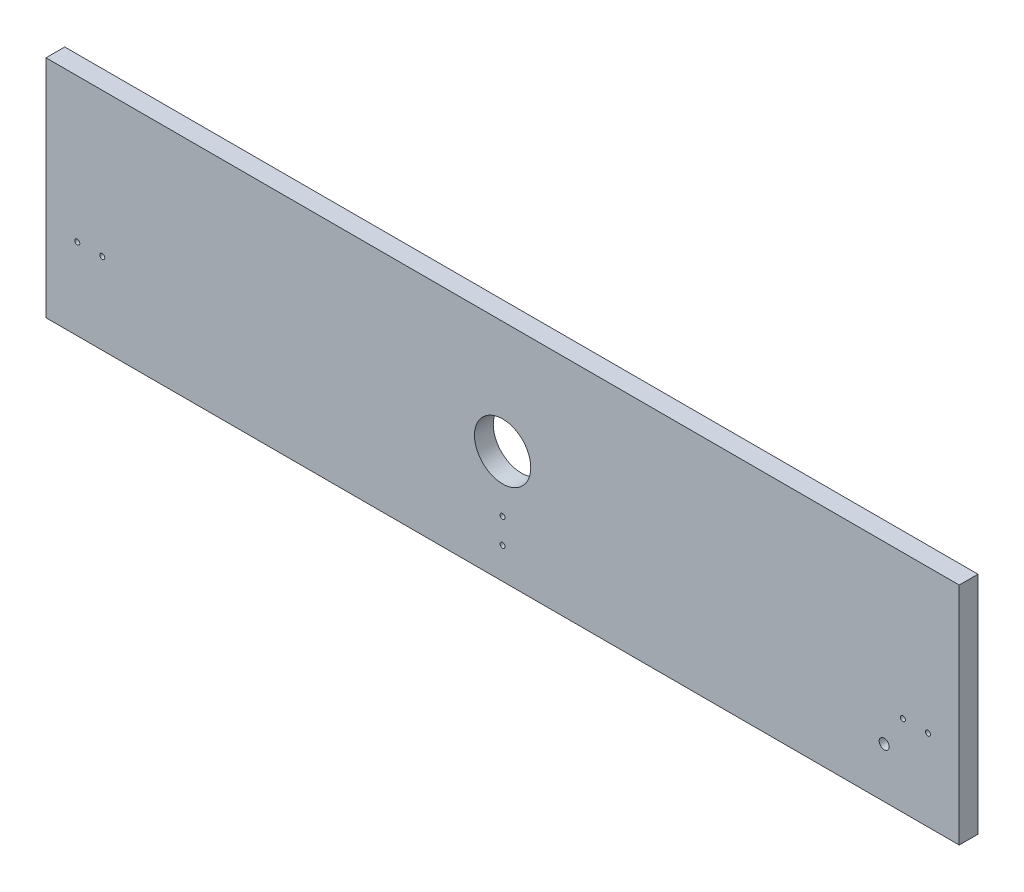
ISO-10303-21;
HEADER;
FILE_DESCRIPTION(('STEP AP214'),'2;1');
FILE_NAME('part.step','',(''),(''),'','','');
FILE_SCHEMA(('AUTOMOTIVE_DESIGN { 1 0 10303 214 1 1 1 1 }'));
ENDSEC;
DATA;
#1=APPLICATION_CONTEXT('core data for automotive mechanical design processes');
#2=APPLICATION_PROTOCOL_DEFINITION('international standard','automotive_design',2000,#1);
#3=PRODUCT_CONTEXT('',#1,'mechanical');
#4=PRODUCT('Part','Part','',(#3));
#5=PRODUCT_RELATED_PRODUCT_CATEGORY('part','',(#4));
#6=PRODUCT_DEFINITION_FORMATION('','',#4);
#7=PRODUCT_DEFINITION_CONTEXT('part definition',#1,'design');
#8=PRODUCT_DEFINITION('design','',#6,#7);
#9=PRODUCT_DEFINITION_SHAPE('','',#8);
#10=(LENGTH_UNIT() NAMED_UNIT(*) SI_UNIT(.MILLI.,.METRE.));
#11=(NAMED_UNIT(*) PLANE_ANGLE_UNIT() SI_UNIT($,.RADIAN.));
#12=(NAMED_UNIT(*) SI_UNIT($,.STERADIAN.) SOLID_ANGLE_UNIT());
#13=UNCERTAINTY_MEASURE_WITH_UNIT(LENGTH_MEASURE(1.E-05),#10,'distance_accuracy_value','');
#14=(GEOMETRIC_REPRESENTATION_CONTEXT(3) GLOBAL_UNCERTAINTY_ASSIGNED_CONTEXT((#13)) GLOBAL_UNIT_ASSIGNED_CONTEXT((#10,
#11,#12)) REPRESENTATION_CONTEXT('',''));
#15=CARTESIAN_POINT('',(0.,0.,0.));
#16=DIRECTION('',(0.,0.,1.));
#17=DIRECTION('',(1.,0.,0.));
#18=AXIS2_PLACEMENT_3D('',#15,#16,#17);
#19=CARTESIAN_POINT('',(365.,-90.,15.));
#20=DIRECTION('',(-1.,0.,0.));
#21=DIRECTION('',(0.,-1.,0.));
#22=AXIS2_PLACEMENT_3D('',#19,#20,#21);
#23=PLANE('',#22);
#24=DIRECTION('',(0.,1.,0.));
#25=VECTOR('',#24,1.);
#26=CARTESIAN_POINT('',(365.,-90.,0.));
#27=LINE('',#26,#25);
#28=CARTESIAN_POINT('',(365.,-90.,0.));
#29=VERTEX_POINT('',#28);
#30=CARTESIAN_POINT('',(365.,90.,0.));
#31=VERTEX_POINT('',#30);
#32=EDGE_CURVE('E96',#29,#31,#27,.T.);
#33=ORIENTED_EDGE('',*,*,#32,.T.);
#34=DIRECTION('',(0.,0.,-1.));
#35=VECTOR('',#34,1.);
#36=CARTESIAN_POINT('',(365.,90.,15.));
#37=LINE('',#36,#35);
#38=CARTESIAN_POINT('',(365.,90.,15.));
#39=VERTEX_POINT('',#38);
#40=EDGE_CURVE('E11',#39,#31,#37,.T.);
#41=ORIENTED_EDGE('',*,*,#40,.F.);
#42=DIRECTION('',(0.,1.,0.));
#43=VECTOR('',#42,1.);
#44=CARTESIAN_POINT('',(365.,-90.,15.));
#45=LINE('',#44,#43);
#46=CARTESIAN_POINT('',(365.,-90.,15.));
#47=VERTEX_POINT('',#46);
#48=EDGE_CURVE('E84',#47,#39,#45,.T.);
#49=ORIENTED_EDGE('',*,*,#48,.F.);
#50=DIRECTION('',(0.,0.,-1.));
#51=VECTOR('',#50,1.);
#52=CARTESIAN_POINT('',(365.,-90.,15.));
#53=LINE('',#52,#51);
#54=EDGE_CURVE('E92',#47,#29,#53,.T.);
#55=ORIENTED_EDGE('',*,*,#54,.T.);
#56=EDGE_LOOP('',(#33,#41,#49,#55));
#57=FACE_BOUND('',#56,.T.);
#58=ADVANCED_FACE('F33',(#57),#23,.F.);
#59=CARTESIAN_POINT('',(-365.,90.,15.));
#60=DIRECTION('',(0.,-1.,0.));
#61=DIRECTION('',(0.,0.,-1.));
#62=AXIS2_PLACEMENT_3D('',#59,#60,#61);
#63=PLANE('',#62);
#64=DIRECTION('',(-1.,0.,0.));
#65=VECTOR('',#64,1.);
#66=CARTESIAN_POINT('',(-365.,90.,0.));
#67=LINE('',#66,#65);
#68=CARTESIAN_POINT('',(-365.,90.,0.));
#69=VERTEX_POINT('',#68);
#70=EDGE_CURVE('E88',#31,#69,#67,.T.);
#71=ORIENTED_EDGE('',*,*,#70,.T.);
#72=DIRECTION('',(0.,0.,-1.));
#73=VECTOR('',#72,1.);
#74=CARTESIAN_POINT('',(-365.,90.,15.));
#75=LINE('',#74,#73);
#76=CARTESIAN_POINT('',(-365.,90.,15.));
#77=VERTEX_POINT('',#76);
#78=EDGE_CURVE('E41',#77,#69,#75,.T.);
#79=ORIENTED_EDGE('',*,*,#78,.F.);
#80=DIRECTION('',(-1.,0.,0.));
#81=VECTOR('',#80,1.);
#82=CARTESIAN_POINT('',(-365.,90.,15.));
#83=LINE('',#82,#81);
#84=EDGE_CURVE('E79',#39,#77,#83,.T.);
#85=ORIENTED_EDGE('',*,*,#84,.F.);
#86=ORIENTED_EDGE('',*,*,#40,.T.);
#87=EDGE_LOOP('',(#71,#79,#85,#86));
#88=FACE_BOUND('',#87,.T.);
#89=ADVANCED_FACE('F87',(#88),#63,.F.);
#90=CARTESIAN_POINT('',(-365.,-90.,15.));
#91=DIRECTION('',(1.,0.,0.));
#92=DIRECTION('',(0.,1.,0.));
#93=AXIS2_PLACEMENT_3D('',#90,#91,#92);
#94=PLANE('',#93);
#95=DIRECTION('',(0.,-1.,0.));
#96=VECTOR('',#95,1.);
#97=CARTESIAN_POINT('',(-365.,-90.,0.));
#98=LINE('',#97,#96);
#99=CARTESIAN_POINT('',(-365.,-90.,0.));
#100=VERTEX_POINT('',#99);
#101=EDGE_CURVE('E66',#69,#100,#98,.T.);
#102=ORIENTED_EDGE('',*,*,#101,.T.);
#103=DIRECTION('',(0.,0.,-1.));
#104=VECTOR('',#103,1.);
#105=CARTESIAN_POINT('',(-365.,-90.,15.));
#106=LINE('',#105,#104);
#107=CARTESIAN_POINT('',(-365.,-90.,15.));
#108=VERTEX_POINT('',#107);
#109=EDGE_CURVE('E89',#108,#100,#106,.T.);
#110=ORIENTED_EDGE('',*,*,#109,.F.);
#111=DIRECTION('',(0.,-1.,0.));
#112=VECTOR('',#111,1.);
#113=CARTESIAN_POINT('',(-365.,-90.,15.));
#114=LINE('',#113,#112);
#115=EDGE_CURVE('E82',#77,#108,#114,.T.);
#116=ORIENTED_EDGE('',*,*,#115,.F.);
#117=ORIENTED_EDGE('',*,*,#78,.T.);
#118=EDGE_LOOP('',(#102,#110,#116,#117));
#119=FACE_BOUND('',#118,.T.);
#120=ADVANCED_FACE('F90',(#119),#94,.F.);
#121=CARTESIAN_POINT('',(-365.,-90.,15.));
#122=DIRECTION('',(0.,1.,0.));
#123=DIRECTION('',(0.,0.,1.));
#124=AXIS2_PLACEMENT_3D('',#121,#122,#123);
#125=PLANE('',#124);
#126=DIRECTION('',(1.,0.,0.));
#127=VECTOR('',#126,1.);
#128=CARTESIAN_POINT('',(-365.,-90.,0.));
#129=LINE('',#128,#127);
#130=EDGE_CURVE('E72',#100,#29,#129,.T.);
#131=ORIENTED_EDGE('',*,*,#130,.T.);
#132=ORIENTED_EDGE('',*,*,#54,.F.);
#133=DIRECTION('',(1.,0.,0.));
#134=VECTOR('',#133,1.);
#135=CARTESIAN_POINT('',(-365.,-90.,15.));
#136=LINE('',#135,#134);
#137=EDGE_CURVE('E49',#108,#47,#136,.T.);
#138=ORIENTED_EDGE('',*,*,#137,.F.);
#139=ORIENTED_EDGE('',*,*,#109,.T.);
#140=EDGE_LOOP('',(#131,#132,#138,#139));
#141=FACE_BOUND('',#140,.T.);
#142=ADVANCED_FACE('F104',(#141),#125,.F.);
#143=CARTESIAN_POINT('',(0.,0.,15.));
#144=DIRECTION('',(0.,0.,-1.));
#145=DIRECTION('',(-1.,0.,0.));
#146=AXIS2_PLACEMENT_3D('',#143,#144,#145);
#147=PLANE('',#146);
#148=CARTESIAN_POINT('',(305.,-50.,15.));
#149=DIRECTION('',(0.,0.,-1.));
#150=DIRECTION('',(-1.,0.,0.));
#151=AXIS2_PLACEMENT_3D('',#148,#149,#150);
#152=CIRCLE('',#151,3.99999999999999);
#153=CARTESIAN_POINT('',(301.,-50.,15.));
#154=VERTEX_POINT('',#153);
#155=EDGE_CURVE('E151',#154,#154,#152,.F.);
#156=ORIENTED_EDGE('',*,*,#155,.F.);
#157=EDGE_LOOP('',(#156));
#158=FACE_BOUND('',#157,.T.);
#159=CARTESIAN_POINT('',(0.,0.,15.));
#160=DIRECTION('',(0.,0.,1.));
#161=DIRECTION('',(1.,0.,0.));
#162=AXIS2_PLACEMENT_3D('',#159,#160,#161);
#163=CIRCLE('',#162,22.5);
#164=CARTESIAN_POINT('',(22.5,0.,15.));
#165=VERTEX_POINT('',#164);
#166=EDGE_CURVE('E148',#165,#165,#163,.T.);
#167=ORIENTED_EDGE('',*,*,#166,.F.);
#168=EDGE_LOOP('',(#167));
#169=FACE_BOUND('',#168,.T.);
#170=CARTESIAN_POINT('',(320.,-24.9999999999999,15.));
#171=DIRECTION('',(0.,0.,1.));
#172=DIRECTION('',(1.,0.,0.));
#173=AXIS2_PLACEMENT_3D('',#170,#171,#172);
#174=CIRCLE('',#173,2.);
#175=CARTESIAN_POINT('',(322.,-24.9999999999999,15.));
#176=VERTEX_POINT('',#175);
#177=EDGE_CURVE('E140',#176,#176,#174,.T.);
#178=ORIENTED_EDGE('',*,*,#177,.F.);
#179=EDGE_LOOP('',(#178));
#180=FACE_BOUND('',#179,.T.);
#181=CARTESIAN_POINT('',(340.,-25.,15.));
#182=DIRECTION('',(0.,0.,1.));
#183=DIRECTION('',(1.,0.,0.));
#184=AXIS2_PLACEMENT_3D('',#181,#182,#183);
#185=CIRCLE('',#184,2.);
#186=CARTESIAN_POINT('',(342.,-25.,15.));
#187=VERTEX_POINT('',#186);
#188=EDGE_CURVE('E134',#187,#187,#185,.T.);
#189=ORIENTED_EDGE('',*,*,#188,.F.);
#190=EDGE_LOOP('',(#189));
#191=FACE_BOUND('',#190,.T.);
#192=CARTESIAN_POINT('',(-320.,-25.,15.));
#193=DIRECTION('',(0.,0.,1.));
#194=DIRECTION('',(1.,0.,0.));
#195=AXIS2_PLACEMENT_3D('',#192,#193,#194);
#196=CIRCLE('',#195,2.);
#197=CARTESIAN_POINT('',(-318.,-25.,15.));
#198=VERTEX_POINT('',#197);
#199=EDGE_CURVE('E128',#198,#198,#196,.T.);
#200=ORIENTED_EDGE('',*,*,#199,.F.);
#201=EDGE_LOOP('',(#200));
#202=FACE_BOUND('',#201,.T.);
#203=CARTESIAN_POINT('',(0.,-45.,15.));
#204=DIRECTION('',(0.,0.,1.));
#205=DIRECTION('',(1.,0.,0.));
#206=AXIS2_PLACEMENT_3D('',#203,#204,#205);
#207=CIRCLE('',#206,2.);
#208=CARTESIAN_POINT('',(2.,-45.,15.));
#209=VERTEX_POINT('',#208);
#210=EDGE_CURVE('E122',#209,#209,#207,.T.);
#211=ORIENTED_EDGE('',*,*,#210,.F.);
#212=EDGE_LOOP('',(#211));
#213=FACE_BOUND('',#212,.T.);
#214=CARTESIAN_POINT('',(0.,-65.,15.));
#215=DIRECTION('',(0.,0.,1.));
#216=DIRECTION('',(1.,0.,0.));
#217=AXIS2_PLACEMENT_3D('',#214,#215,#216);
#218=CIRCLE('',#217,2.);
#219=CARTESIAN_POINT('',(2.,-65.,15.));
#220=VERTEX_POINT('',#219);
#221=EDGE_CURVE('E116',#220,#220,#218,.T.);
#222=ORIENTED_EDGE('',*,*,#221,.F.);
#223=EDGE_LOOP('',(#222));
#224=FACE_BOUND('',#223,.T.);
#225=CARTESIAN_POINT('',(-340.,-25.,15.));
#226=DIRECTION('',(0.,0.,1.));
#227=DIRECTION('',(1.,0.,0.));
#228=AXIS2_PLACEMENT_3D('',#225,#226,#227);
#229=CIRCLE('',#228,2.);
#230=CARTESIAN_POINT('',(-338.,-25.,15.));
#231=VERTEX_POINT('',#230);
#232=EDGE_CURVE('E110',#231,#231,#229,.T.);
#233=ORIENTED_EDGE('',*,*,#232,.F.);
#234=EDGE_LOOP('',(#233));
#235=FACE_BOUND('',#234,.T.);
#236=ORIENTED_EDGE('',*,*,#48,.T.);
#237=ORIENTED_EDGE('',*,*,#84,.T.);
#238=ORIENTED_EDGE('',*,*,#115,.T.);
#239=ORIENTED_EDGE('',*,*,#137,.T.);
#240=EDGE_LOOP('',(#236,#237,#238,#239));
#241=FACE_BOUND('',#240,.T.);
#242=ADVANCED_FACE('F80',(#158,#169,#180,#191,#202,#213,#224,#235,#241),#147,.F.);
#243=CARTESIAN_POINT('',(0.,0.,0.));
#244=DIRECTION('',(0.,0.,-1.));
#245=DIRECTION('',(-1.,0.,0.));
#246=AXIS2_PLACEMENT_3D('',#243,#244,#245);
#247=PLANE('',#246);
#248=CARTESIAN_POINT('',(305.,-50.,0.));
#249=DIRECTION('',(0.,0.,-1.));
#250=DIRECTION('',(-1.,0.,0.));
#251=AXIS2_PLACEMENT_3D('',#248,#249,#250);
#252=CIRCLE('',#251,3.99999999999999);
#253=CARTESIAN_POINT('',(301.,-50.,0.));
#254=VERTEX_POINT('',#253);
#255=EDGE_CURVE('E154',#254,#254,#252,.T.);
#256=ORIENTED_EDGE('',*,*,#255,.F.);
#257=EDGE_LOOP('',(#256));
#258=FACE_BOUND('',#257,.T.);
#259=CARTESIAN_POINT('',(0.,0.,0.));
#260=DIRECTION('',(0.,0.,-1.));
#261=DIRECTION('',(-1.,0.,0.));
#262=AXIS2_PLACEMENT_3D('',#259,#260,#261);
#263=CIRCLE('',#262,22.5);
#264=CARTESIAN_POINT('',(-22.5,0.,0.));
#265=VERTEX_POINT('',#264);
#266=EDGE_CURVE('E143',#265,#265,#263,.F.);
#267=ORIENTED_EDGE('',*,*,#266,.T.);
#268=EDGE_LOOP('',(#267));
#269=FACE_BOUND('',#268,.T.);
#270=ORIENTED_EDGE('',*,*,#32,.F.);
#271=ORIENTED_EDGE('',*,*,#130,.F.);
#272=ORIENTED_EDGE('',*,*,#101,.F.);
#273=ORIENTED_EDGE('',*,*,#70,.F.);
#274=EDGE_LOOP('',(#270,#271,#272,#273));
#275=FACE_BOUND('',#274,.T.);
#276=ADVANCED_FACE('F107',(#258,#269,#275),#247,.T.);
#277=CARTESIAN_POINT('',(-340.,-25.,5.));
#278=DIRECTION('',(0.,0.,1.));
#279=DIRECTION('',(1.,0.,0.));
#280=AXIS2_PLACEMENT_3D('',#277,#278,#279);
#281=CYLINDRICAL_SURFACE('',#280,2.);
#282=CARTESIAN_POINT('',(-340.,-25.,5.));
#283=DIRECTION('',(0.,0.,1.));
#284=DIRECTION('',(1.,0.,0.));
#285=AXIS2_PLACEMENT_3D('',#282,#283,#284);
#286=CIRCLE('',#285,2.);
#287=CARTESIAN_POINT('',(-338.,-25.,5.));
#288=VERTEX_POINT('',#287);
#289=EDGE_CURVE('E99',#288,#288,#286,.T.);
#290=ORIENTED_EDGE('',*,*,#289,.F.);
#291=EDGE_LOOP('',(#290));
#292=FACE_BOUND('',#291,.T.);
#293=ORIENTED_EDGE('',*,*,#232,.T.);
#294=EDGE_LOOP('',(#293));
#295=FACE_BOUND('',#294,.T.);
#296=ADVANCED_FACE('F162',(#292,#295),#281,.F.);
#297=CARTESIAN_POINT('',(-340.,-25.,5.));
#298=DIRECTION('',(0.,0.,1.));
#299=DIRECTION('',(1.,0.,0.));
#300=AXIS2_PLACEMENT_3D('',#297,#298,#299);
#301=PLANE('',#300);
#302=ORIENTED_EDGE('',*,*,#289,.T.);
#303=EDGE_LOOP('',(#302));
#304=FACE_BOUND('',#303,.T.);
#305=ADVANCED_FACE('F196',(#304),#301,.T.);
#306=CARTESIAN_POINT('',(0.,-65.,5.));
#307=DIRECTION('',(0.,0.,1.));
#308=DIRECTION('',(1.,0.,0.));
#309=AXIS2_PLACEMENT_3D('',#306,#307,#308);
#310=CYLINDRICAL_SURFACE('',#309,2.);
#311=CARTESIAN_POINT('',(0.,-65.,5.));
#312=DIRECTION('',(0.,0.,1.));
#313=DIRECTION('',(1.,0.,0.));
#314=AXIS2_PLACEMENT_3D('',#311,#312,#313);
#315=CIRCLE('',#314,2.);
#316=CARTESIAN_POINT('',(2.,-65.,5.));
#317=VERTEX_POINT('',#316);
#318=EDGE_CURVE('E113',#317,#317,#315,.T.);
#319=ORIENTED_EDGE('',*,*,#318,.F.);
#320=EDGE_LOOP('',(#319));
#321=FACE_BOUND('',#320,.T.);
#322=ORIENTED_EDGE('',*,*,#221,.T.);
#323=EDGE_LOOP('',(#322));
#324=FACE_BOUND('',#323,.T.);
#325=ADVANCED_FACE('F200',(#321,#324),#310,.F.);
#326=CARTESIAN_POINT('',(0.,-65.,5.));
#327=DIRECTION('',(0.,0.,1.));
#328=DIRECTION('',(1.,0.,0.));
#329=AXIS2_PLACEMENT_3D('',#326,#327,#328);
#330=PLANE('',#329);
#331=ORIENTED_EDGE('',*,*,#318,.T.);
#332=EDGE_LOOP('',(#331));
#333=FACE_BOUND('',#332,.T.);
#334=ADVANCED_FACE('F204',(#333),#330,.T.);
#335=CARTESIAN_POINT('',(0.,-45.,5.));
#336=DIRECTION('',(0.,0.,1.));
#337=DIRECTION('',(1.,0.,0.));
#338=AXIS2_PLACEMENT_3D('',#335,#336,#337);
#339=CYLINDRICAL_SURFACE('',#338,2.);
#340=CARTESIAN_POINT('',(0.,-45.,5.));
#341=DIRECTION('',(0.,0.,1.));
#342=DIRECTION('',(1.,0.,0.));
#343=AXIS2_PLACEMENT_3D('',#340,#341,#342);
#344=CIRCLE('',#343,2.);
#345=CARTESIAN_POINT('',(2.,-45.,5.));
#346=VERTEX_POINT('',#345);
#347=EDGE_CURVE('E119',#346,#346,#344,.T.);
#348=ORIENTED_EDGE('',*,*,#347,.F.);
#349=EDGE_LOOP('',(#348));
#350=FACE_BOUND('',#349,.T.);
#351=ORIENTED_EDGE('',*,*,#210,.T.);
#352=EDGE_LOOP('',(#351));
#353=FACE_BOUND('',#352,.T.);
#354=ADVANCED_FACE('F208',(#350,#353),#339,.F.);
#355=CARTESIAN_POINT('',(0.,-45.,5.));
#356=DIRECTION('',(0.,0.,1.));
#357=DIRECTION('',(1.,0.,0.));
#358=AXIS2_PLACEMENT_3D('',#355,#356,#357);
#359=PLANE('',#358);
#360=ORIENTED_EDGE('',*,*,#347,.T.);
#361=EDGE_LOOP('',(#360));
#362=FACE_BOUND('',#361,.T.);
#363=ADVANCED_FACE('F212',(#362),#359,.T.);
#364=CARTESIAN_POINT('',(-320.,-25.,5.));
#365=DIRECTION('',(0.,0.,1.));
#366=DIRECTION('',(1.,0.,0.));
#367=AXIS2_PLACEMENT_3D('',#364,#365,#366);
#368=CYLINDRICAL_SURFACE('',#367,2.);
#369=CARTESIAN_POINT('',(-320.,-25.,5.));
#370=DIRECTION('',(0.,0.,1.));
#371=DIRECTION('',(1.,0.,0.));
#372=AXIS2_PLACEMENT_3D('',#369,#370,#371);
#373=CIRCLE('',#372,2.);
#374=CARTESIAN_POINT('',(-318.,-25.,5.));
#375=VERTEX_POINT('',#374);
#376=EDGE_CURVE('E125',#375,#375,#373,.T.);
#377=ORIENTED_EDGE('',*,*,#376,.F.);
#378=EDGE_LOOP('',(#377));
#379=FACE_BOUND('',#378,.T.);
#380=ORIENTED_EDGE('',*,*,#199,.T.);
#381=EDGE_LOOP('',(#380));
#382=FACE_BOUND('',#381,.T.);
#383=ADVANCED_FACE('F216',(#379,#382),#368,.F.);
#384=CARTESIAN_POINT('',(-320.,-25.,5.));
#385=DIRECTION('',(0.,0.,1.));
#386=DIRECTION('',(1.,0.,0.));
#387=AXIS2_PLACEMENT_3D('',#384,#385,#386);
#388=PLANE('',#387);
#389=ORIENTED_EDGE('',*,*,#376,.T.);
#390=EDGE_LOOP('',(#389));
#391=FACE_BOUND('',#390,.T.);
#392=ADVANCED_FACE('F220',(#391),#388,.T.);
#393=CARTESIAN_POINT('',(340.,-25.,5.));
#394=DIRECTION('',(0.,0.,1.));
#395=DIRECTION('',(1.,0.,0.));
#396=AXIS2_PLACEMENT_3D('',#393,#394,#395);
#397=CYLINDRICAL_SURFACE('',#396,2.);
#398=CARTESIAN_POINT('',(340.,-25.,5.));
#399=DIRECTION('',(0.,0.,1.));
#400=DIRECTION('',(1.,0.,0.));
#401=AXIS2_PLACEMENT_3D('',#398,#399,#400);
#402=CIRCLE('',#401,2.);
#403=CARTESIAN_POINT('',(342.,-25.,5.));
#404=VERTEX_POINT('',#403);
#405=EDGE_CURVE('E131',#404,#404,#402,.T.);
#406=ORIENTED_EDGE('',*,*,#405,.F.);
#407=EDGE_LOOP('',(#406));
#408=FACE_BOUND('',#407,.T.);
#409=ORIENTED_EDGE('',*,*,#188,.T.);
#410=EDGE_LOOP('',(#409));
#411=FACE_BOUND('',#410,.T.);
#412=ADVANCED_FACE('F224',(#408,#411),#397,.F.);
#413=CARTESIAN_POINT('',(340.,-25.,5.));
#414=DIRECTION('',(0.,0.,1.));
#415=DIRECTION('',(1.,0.,0.));
#416=AXIS2_PLACEMENT_3D('',#413,#414,#415);
#417=PLANE('',#416);
#418=ORIENTED_EDGE('',*,*,#405,.T.);
#419=EDGE_LOOP('',(#418));
#420=FACE_BOUND('',#419,.T.);
#421=ADVANCED_FACE('F228',(#420),#417,.T.);
#422=CARTESIAN_POINT('',(320.,-24.9999999999999,5.));
#423=DIRECTION('',(0.,0.,1.));
#424=DIRECTION('',(1.,0.,0.));
#425=AXIS2_PLACEMENT_3D('',#422,#423,#424);
#426=CYLINDRICAL_SURFACE('',#425,2.);
#427=CARTESIAN_POINT('',(320.,-24.9999999999999,5.));
#428=DIRECTION('',(0.,0.,1.));
#429=DIRECTION('',(1.,0.,0.));
#430=AXIS2_PLACEMENT_3D('',#427,#428,#429);
#431=CIRCLE('',#430,2.);
#432=CARTESIAN_POINT('',(322.,-24.9999999999999,5.));
#433=VERTEX_POINT('',#432);
#434=EDGE_CURVE('E137',#433,#433,#431,.T.);
#435=ORIENTED_EDGE('',*,*,#434,.F.);
#436=EDGE_LOOP('',(#435));
#437=FACE_BOUND('',#436,.T.);
#438=ORIENTED_EDGE('',*,*,#177,.T.);
#439=EDGE_LOOP('',(#438));
#440=FACE_BOUND('',#439,.T.);
#441=ADVANCED_FACE('F177',(#437,#440),#426,.F.);
#442=CARTESIAN_POINT('',(320.,-24.9999999999999,5.));
#443=DIRECTION('',(0.,0.,1.));
#444=DIRECTION('',(1.,0.,0.));
#445=AXIS2_PLACEMENT_3D('',#442,#443,#444);
#446=PLANE('',#445);
#447=ORIENTED_EDGE('',*,*,#434,.T.);
#448=EDGE_LOOP('',(#447));
#449=FACE_BOUND('',#448,.T.);
#450=ADVANCED_FACE('F168',(#449),#446,.T.);
#451=CARTESIAN_POINT('',(0.,0.,-63.6396103067893));
#452=DIRECTION('',(0.,0.,1.));
#453=DIRECTION('',(1.,0.,0.));
#454=AXIS2_PLACEMENT_3D('',#451,#452,#453);
#455=CYLINDRICAL_SURFACE('',#454,22.5);
#456=ORIENTED_EDGE('',*,*,#166,.T.);
#457=EDGE_LOOP('',(#456));
#458=FACE_BOUND('',#457,.T.);
#459=ORIENTED_EDGE('',*,*,#266,.F.);
#460=EDGE_LOOP('',(#459));
#461=FACE_BOUND('',#460,.T.);
#462=ADVANCED_FACE('F166',(#458,#461),#455,.F.);
#463=CARTESIAN_POINT('',(305.,-50.,26.3137084989848));
#464=DIRECTION('',(0.,0.,-1.));
#465=DIRECTION('',(-1.,0.,0.));
#466=AXIS2_PLACEMENT_3D('',#463,#464,#465);
#467=CYLINDRICAL_SURFACE('',#466,3.99999999999999);
#468=ORIENTED_EDGE('',*,*,#155,.T.);
#469=EDGE_LOOP('',(#468));
#470=FACE_BOUND('',#469,.T.);
#471=ORIENTED_EDGE('',*,*,#255,.T.);
#472=EDGE_LOOP('',(#471));
#473=FACE_BOUND('',#472,.T.);
#474=ADVANCED_FACE('F158',(#470,#473),#467,.F.);
#475=CLOSED_SHELL('',(#58,#89,#120,#142,#242,#276,#296,#305,#325,#334,#354,#363,#383,#392,#412,
#421,#441,#450,#462,#474));
#476=MANIFOLD_SOLID_BREP('B2',#475);
#477=ADVANCED_BREP_SHAPE_REPRESENTATION('',(#18,#476),#14);
#478=SHAPE_DEFINITION_REPRESENTATION(#9,#477);
ENDSEC;
END-ISO-10303-21;
